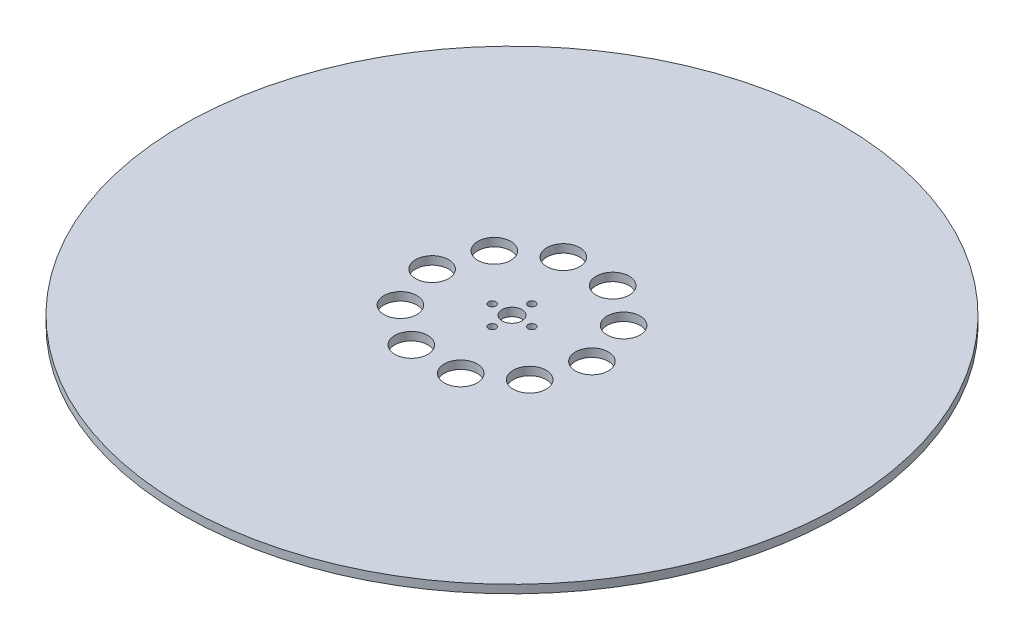
ISO-10303-21;
HEADER;
FILE_DESCRIPTION(('STEP AP214'),'2;1');
FILE_NAME('part.step','',(''),(''),'','','');
FILE_SCHEMA(('AUTOMOTIVE_DESIGN { 1 0 10303 214 1 1 1 1 }'));
ENDSEC;
DATA;
#1=APPLICATION_CONTEXT('core data for automotive mechanical design processes');
#2=APPLICATION_PROTOCOL_DEFINITION('international standard','automotive_design',2000,#1);
#3=PRODUCT_CONTEXT('',#1,'mechanical');
#4=PRODUCT('Part','Part','',(#3));
#5=PRODUCT_RELATED_PRODUCT_CATEGORY('part','',(#4));
#6=PRODUCT_DEFINITION_FORMATION('','',#4);
#7=PRODUCT_DEFINITION_CONTEXT('part definition',#1,'design');
#8=PRODUCT_DEFINITION('design','',#6,#7);
#9=PRODUCT_DEFINITION_SHAPE('','',#8);
#10=(LENGTH_UNIT() NAMED_UNIT(*) SI_UNIT(.MILLI.,.METRE.));
#11=(NAMED_UNIT(*) PLANE_ANGLE_UNIT() SI_UNIT($,.RADIAN.));
#12=(NAMED_UNIT(*) SI_UNIT($,.STERADIAN.) SOLID_ANGLE_UNIT());
#13=UNCERTAINTY_MEASURE_WITH_UNIT(LENGTH_MEASURE(1.E-05),#10,'distance_accuracy_value','');
#14=(GEOMETRIC_REPRESENTATION_CONTEXT(3) GLOBAL_UNCERTAINTY_ASSIGNED_CONTEXT((#13)) GLOBAL_UNIT_ASSIGNED_CONTEXT((#10,
#11,#12)) REPRESENTATION_CONTEXT('',''));
#15=CARTESIAN_POINT('',(0.,0.,0.));
#16=DIRECTION('',(0.,0.,1.));
#17=DIRECTION('',(1.,0.,0.));
#18=AXIS2_PLACEMENT_3D('',#15,#16,#17);
#19=CARTESIAN_POINT('',(0.,5.,0.));
#20=DIRECTION('',(0.,1.,0.));
#21=DIRECTION('',(0.,0.,1.));
#22=AXIS2_PLACEMENT_3D('',#19,#20,#21);
#23=PLANE('',#22);
#24=CARTESIAN_POINT('',(0.,5.,12.));
#25=DIRECTION('',(0.,1.,0.));
#26=DIRECTION('',(0.,0.,1.));
#27=AXIS2_PLACEMENT_3D('',#24,#25,#26);
#28=CIRCLE('',#27,2.24999999999956);
#29=CARTESIAN_POINT('',(0.,5.,14.2499999999996));
#30=VERTEX_POINT('',#29);
#31=EDGE_CURVE('E123',#30,#30,#28,.T.);
#32=ORIENTED_EDGE('',*,*,#31,.F.);
#33=EDGE_LOOP('',(#32));
#34=FACE_BOUND('',#33,.T.);
#35=CARTESIAN_POINT('',(0.,5.,0.));
#36=DIRECTION('',(0.,1.,0.));
#37=DIRECTION('',(0.,0.,1.));
#38=AXIS2_PLACEMENT_3D('',#35,#36,#37);
#39=CIRCLE('',#38,6.);
#40=CARTESIAN_POINT('',(0.,5.,6.));
#41=VERTEX_POINT('',#40);
#42=EDGE_CURVE('E111',#41,#41,#39,.T.);
#43=ORIENTED_EDGE('',*,*,#42,.F.);
#44=EDGE_LOOP('',(#43));
#45=FACE_BOUND('',#44,.T.);
#46=CARTESIAN_POINT('',(-39.2328769925078,5.,-28.504353631061));
#47=DIRECTION('',(0.,1.,0.));
#48=DIRECTION('',(0.,0.,1.));
#49=AXIS2_PLACEMENT_3D('',#46,#47,#48);
#50=CIRCLE('',#49,10.);
#51=CARTESIAN_POINT('',(-39.2328769925078,5.,-18.504353631061));
#52=VERTEX_POINT('',#51);
#53=EDGE_CURVE('E99',#52,#52,#50,.T.);
#54=ORIENTED_EDGE('',*,*,#53,.F.);
#55=EDGE_LOOP('',(#54));
#56=FACE_BOUND('',#55,.T.);
#57=CARTESIAN_POINT('',(-39.2328769925087,5.,28.5043536310598));
#58=DIRECTION('',(0.,1.,0.));
#59=DIRECTION('',(0.,0.,1.));
#60=AXIS2_PLACEMENT_3D('',#57,#58,#59);
#61=CIRCLE('',#60,10.);
#62=CARTESIAN_POINT('',(-39.2328769925087,5.,38.5043536310598));
#63=VERTEX_POINT('',#62);
#64=EDGE_CURVE('E87',#63,#63,#61,.T.);
#65=ORIENTED_EDGE('',*,*,#64,.F.);
#66=EDGE_LOOP('',(#65));
#67=FACE_BOUND('',#66,.T.);
#68=CARTESIAN_POINT('',(14.9856255346939,5.,46.1210130024023));
#69=DIRECTION('',(0.,1.,0.));
#70=DIRECTION('',(0.,0.,1.));
#71=AXIS2_PLACEMENT_3D('',#68,#69,#70);
#72=CIRCLE('',#71,10.);
#73=CARTESIAN_POINT('',(14.9856255346939,5.,56.1210130024023));
#74=VERTEX_POINT('',#73);
#75=EDGE_CURVE('E75',#74,#74,#72,.T.);
#76=ORIENTED_EDGE('',*,*,#75,.F.);
#77=EDGE_LOOP('',(#76));
#78=FACE_BOUND('',#77,.T.);
#79=CARTESIAN_POINT('',(48.4945029156278,5.,4.45823933326039E-13));
#80=DIRECTION('',(0.,1.,0.));
#81=DIRECTION('',(0.,0.,1.));
#82=AXIS2_PLACEMENT_3D('',#79,#80,#81);
#83=CIRCLE('',#82,10.);
#84=CARTESIAN_POINT('',(48.4945029156278,5.,10.0000000000005));
#85=VERTEX_POINT('',#84);
#86=EDGE_CURVE('E63',#85,#85,#83,.T.);
#87=ORIENTED_EDGE('',*,*,#86,.F.);
#88=EDGE_LOOP('',(#87));
#89=FACE_BOUND('',#88,.T.);
#90=CARTESIAN_POINT('',(14.9856255346947,5.,-46.121013002402));
#91=DIRECTION('',(0.,1.,0.));
#92=DIRECTION('',(0.,0.,1.));
#93=AXIS2_PLACEMENT_3D('',#90,#91,#92);
#94=CIRCLE('',#93,10.);
#95=CARTESIAN_POINT('',(14.9856255346947,5.,-36.121013002402));
#96=VERTEX_POINT('',#95);
#97=EDGE_CURVE('E51',#96,#96,#94,.T.);
#98=ORIENTED_EDGE('',*,*,#97,.F.);
#99=EDGE_LOOP('',(#98));
#100=FACE_BOUND('',#99,.T.);
#101=CARTESIAN_POINT('',(0.,5.,0.));
#102=DIRECTION('',(0.,1.,0.));
#103=DIRECTION('',(0.,0.,1.));
#104=AXIS2_PLACEMENT_3D('',#101,#102,#103);
#105=CIRCLE('',#104,200.);
#106=CARTESIAN_POINT('',(0.,5.,200.));
#107=VERTEX_POINT('',#106);
#108=EDGE_CURVE('E10',#107,#107,#105,.T.);
#109=ORIENTED_EDGE('',*,*,#108,.T.);
#110=EDGE_LOOP('',(#109));
#111=FACE_BOUND('',#110,.T.);
#112=CARTESIAN_POINT('',(-14.9856255346942,5.,-46.1210130024022));
#113=DIRECTION('',(0.,1.,0.));
#114=DIRECTION('',(0.,0.,1.));
#115=AXIS2_PLACEMENT_3D('',#112,#113,#114);
#116=CIRCLE('',#115,10.);
#117=CARTESIAN_POINT('',(-14.9856255346942,5.,-36.1210130024022));
#118=VERTEX_POINT('',#117);
#119=EDGE_CURVE('E46',#118,#118,#116,.T.);
#120=ORIENTED_EDGE('',*,*,#119,.F.);
#121=EDGE_LOOP('',(#120));
#122=FACE_BOUND('',#121,.T.);
#123=CARTESIAN_POINT('',(39.2328769925085,5.,-28.50435363106));
#124=DIRECTION('',(0.,1.,0.));
#125=DIRECTION('',(0.,0.,1.));
#126=AXIS2_PLACEMENT_3D('',#123,#124,#125);
#127=CIRCLE('',#126,10.);
#128=CARTESIAN_POINT('',(39.2328769925085,5.,-18.50435363106));
#129=VERTEX_POINT('',#128);
#130=EDGE_CURVE('E57',#129,#129,#127,.T.);
#131=ORIENTED_EDGE('',*,*,#130,.F.);
#132=EDGE_LOOP('',(#131));
#133=FACE_BOUND('',#132,.T.);
#134=CARTESIAN_POINT('',(39.232876992508,5.,28.5043536310608));
#135=DIRECTION('',(0.,1.,0.));
#136=DIRECTION('',(0.,0.,1.));
#137=AXIS2_PLACEMENT_3D('',#134,#135,#136);
#138=CIRCLE('',#137,10.);
#139=CARTESIAN_POINT('',(39.232876992508,5.,38.5043536310608));
#140=VERTEX_POINT('',#139);
#141=EDGE_CURVE('E69',#140,#140,#138,.T.);
#142=ORIENTED_EDGE('',*,*,#141,.F.);
#143=EDGE_LOOP('',(#142));
#144=FACE_BOUND('',#143,.T.);
#145=CARTESIAN_POINT('',(-14.9856255346951,5.,46.1210130024019));
#146=DIRECTION('',(0.,1.,0.));
#147=DIRECTION('',(0.,0.,1.));
#148=AXIS2_PLACEMENT_3D('',#145,#146,#147);
#149=CIRCLE('',#148,10.);
#150=CARTESIAN_POINT('',(-14.9856255346951,5.,56.1210130024019));
#151=VERTEX_POINT('',#150);
#152=EDGE_CURVE('E81',#151,#151,#149,.T.);
#153=ORIENTED_EDGE('',*,*,#152,.F.);
#154=EDGE_LOOP('',(#153));
#155=FACE_BOUND('',#154,.T.);
#156=CARTESIAN_POINT('',(-48.4945029156277,5.,-7.92768628521401E-13));
#157=DIRECTION('',(0.,1.,0.));
#158=DIRECTION('',(0.,0.,1.));
#159=AXIS2_PLACEMENT_3D('',#156,#157,#158);
#160=CIRCLE('',#159,10.);
#161=CARTESIAN_POINT('',(-48.4945029156277,5.,9.99999999999921));
#162=VERTEX_POINT('',#161);
#163=EDGE_CURVE('E93',#162,#162,#160,.T.);
#164=ORIENTED_EDGE('',*,*,#163,.F.);
#165=EDGE_LOOP('',(#164));
#166=FACE_BOUND('',#165,.T.);
#167=CARTESIAN_POINT('',(0.,5.,-12.));
#168=DIRECTION('',(0.,1.,0.));
#169=DIRECTION('',(0.,0.,1.));
#170=AXIS2_PLACEMENT_3D('',#167,#168,#169);
#171=CIRCLE('',#170,2.24999999999956);
#172=CARTESIAN_POINT('',(0.,5.,-9.75000000000044));
#173=VERTEX_POINT('',#172);
#174=EDGE_CURVE('E105',#173,#173,#171,.T.);
#175=ORIENTED_EDGE('',*,*,#174,.F.);
#176=EDGE_LOOP('',(#175));
#177=FACE_BOUND('',#176,.T.);
#178=CARTESIAN_POINT('',(12.,5.,0.));
#179=DIRECTION('',(0.,1.,0.));
#180=DIRECTION('',(0.,0.,1.));
#181=AXIS2_PLACEMENT_3D('',#178,#179,#180);
#182=CIRCLE('',#181,2.24999999999956);
#183=CARTESIAN_POINT('',(12.,5.,2.2499999999996));
#184=VERTEX_POINT('',#183);
#185=EDGE_CURVE('E117',#184,#184,#182,.T.);
#186=ORIENTED_EDGE('',*,*,#185,.F.);
#187=EDGE_LOOP('',(#186));
#188=FACE_BOUND('',#187,.T.);
#189=CARTESIAN_POINT('',(-12.,5.,-1.25693328198353E-13));
#190=DIRECTION('',(0.,1.,0.));
#191=DIRECTION('',(0.,0.,1.));
#192=AXIS2_PLACEMENT_3D('',#189,#190,#191);
#193=CIRCLE('',#192,2.24999999999956);
#194=CARTESIAN_POINT('',(-12.,5.,2.24999999999944));
#195=VERTEX_POINT('',#194);
#196=EDGE_CURVE('E129',#195,#195,#193,.T.);
#197=ORIENTED_EDGE('',*,*,#196,.F.);
#198=EDGE_LOOP('',(#197));
#199=FACE_BOUND('',#198,.T.);
#200=ADVANCED_FACE('F35',(#34,#45,#56,#67,#78,#89,#100,#111,#122,#133,#144,#155,#166,#177,#188,
#199),#23,.T.);
#201=CARTESIAN_POINT('',(0.,0.,0.));
#202=DIRECTION('',(0.,1.,0.));
#203=DIRECTION('',(0.,0.,1.));
#204=AXIS2_PLACEMENT_3D('',#201,#202,#203);
#205=PLANE('',#204);
#206=CARTESIAN_POINT('',(0.,0.,0.));
#207=DIRECTION('',(0.,1.,0.));
#208=DIRECTION('',(0.,0.,1.));
#209=AXIS2_PLACEMENT_3D('',#206,#207,#208);
#210=CIRCLE('',#209,200.);
#211=CARTESIAN_POINT('',(0.,0.,200.));
#212=VERTEX_POINT('',#211);
#213=EDGE_CURVE('E39',#212,#212,#210,.T.);
#214=ORIENTED_EDGE('',*,*,#213,.F.);
#215=EDGE_LOOP('',(#214));
#216=FACE_BOUND('',#215,.T.);
#217=CARTESIAN_POINT('',(-14.9856255346942,0.,-46.1210130024022));
#218=DIRECTION('',(0.,1.,0.));
#219=DIRECTION('',(0.,0.,1.));
#220=AXIS2_PLACEMENT_3D('',#217,#218,#219);
#221=CIRCLE('',#220,10.);
#222=CARTESIAN_POINT('',(-14.9856255346942,0.,-36.1210130024022));
#223=VERTEX_POINT('',#222);
#224=EDGE_CURVE('E48',#223,#223,#221,.T.);
#225=ORIENTED_EDGE('',*,*,#224,.T.);
#226=EDGE_LOOP('',(#225));
#227=FACE_BOUND('',#226,.T.);
#228=CARTESIAN_POINT('',(14.9856255346947,0.,-46.121013002402));
#229=DIRECTION('',(0.,1.,0.));
#230=DIRECTION('',(0.,0.,1.));
#231=AXIS2_PLACEMENT_3D('',#228,#229,#230);
#232=CIRCLE('',#231,10.);
#233=CARTESIAN_POINT('',(14.9856255346947,0.,-36.121013002402));
#234=VERTEX_POINT('',#233);
#235=EDGE_CURVE('E54',#234,#234,#232,.T.);
#236=ORIENTED_EDGE('',*,*,#235,.T.);
#237=EDGE_LOOP('',(#236));
#238=FACE_BOUND('',#237,.T.);
#239=CARTESIAN_POINT('',(39.2328769925085,0.,-28.50435363106));
#240=DIRECTION('',(0.,1.,0.));
#241=DIRECTION('',(0.,0.,1.));
#242=AXIS2_PLACEMENT_3D('',#239,#240,#241);
#243=CIRCLE('',#242,10.);
#244=CARTESIAN_POINT('',(39.2328769925085,0.,-18.50435363106));
#245=VERTEX_POINT('',#244);
#246=EDGE_CURVE('E60',#245,#245,#243,.T.);
#247=ORIENTED_EDGE('',*,*,#246,.T.);
#248=EDGE_LOOP('',(#247));
#249=FACE_BOUND('',#248,.T.);
#250=CARTESIAN_POINT('',(48.4945029156278,0.,4.45823933326039E-13));
#251=DIRECTION('',(0.,1.,0.));
#252=DIRECTION('',(0.,0.,1.));
#253=AXIS2_PLACEMENT_3D('',#250,#251,#252);
#254=CIRCLE('',#253,10.);
#255=CARTESIAN_POINT('',(48.4945029156278,0.,10.0000000000005));
#256=VERTEX_POINT('',#255);
#257=EDGE_CURVE('E66',#256,#256,#254,.T.);
#258=ORIENTED_EDGE('',*,*,#257,.T.);
#259=EDGE_LOOP('',(#258));
#260=FACE_BOUND('',#259,.T.);
#261=CARTESIAN_POINT('',(39.232876992508,0.,28.5043536310608));
#262=DIRECTION('',(0.,1.,0.));
#263=DIRECTION('',(0.,0.,1.));
#264=AXIS2_PLACEMENT_3D('',#261,#262,#263);
#265=CIRCLE('',#264,10.);
#266=CARTESIAN_POINT('',(39.232876992508,0.,38.5043536310608));
#267=VERTEX_POINT('',#266);
#268=EDGE_CURVE('E72',#267,#267,#265,.T.);
#269=ORIENTED_EDGE('',*,*,#268,.T.);
#270=EDGE_LOOP('',(#269));
#271=FACE_BOUND('',#270,.T.);
#272=CARTESIAN_POINT('',(14.9856255346939,0.,46.1210130024023));
#273=DIRECTION('',(0.,1.,0.));
#274=DIRECTION('',(0.,0.,1.));
#275=AXIS2_PLACEMENT_3D('',#272,#273,#274);
#276=CIRCLE('',#275,10.);
#277=CARTESIAN_POINT('',(14.9856255346939,0.,56.1210130024023));
#278=VERTEX_POINT('',#277);
#279=EDGE_CURVE('E78',#278,#278,#276,.T.);
#280=ORIENTED_EDGE('',*,*,#279,.T.);
#281=EDGE_LOOP('',(#280));
#282=FACE_BOUND('',#281,.T.);
#283=CARTESIAN_POINT('',(-14.9856255346951,0.,46.1210130024019));
#284=DIRECTION('',(0.,1.,0.));
#285=DIRECTION('',(0.,0.,1.));
#286=AXIS2_PLACEMENT_3D('',#283,#284,#285);
#287=CIRCLE('',#286,10.);
#288=CARTESIAN_POINT('',(-14.9856255346951,0.,56.1210130024019));
#289=VERTEX_POINT('',#288);
#290=EDGE_CURVE('E84',#289,#289,#287,.T.);
#291=ORIENTED_EDGE('',*,*,#290,.T.);
#292=EDGE_LOOP('',(#291));
#293=FACE_BOUND('',#292,.T.);
#294=CARTESIAN_POINT('',(-39.2328769925087,0.,28.5043536310598));
#295=DIRECTION('',(0.,1.,0.));
#296=DIRECTION('',(0.,0.,1.));
#297=AXIS2_PLACEMENT_3D('',#294,#295,#296);
#298=CIRCLE('',#297,10.);
#299=CARTESIAN_POINT('',(-39.2328769925087,0.,38.5043536310598));
#300=VERTEX_POINT('',#299);
#301=EDGE_CURVE('E90',#300,#300,#298,.T.);
#302=ORIENTED_EDGE('',*,*,#301,.T.);
#303=EDGE_LOOP('',(#302));
#304=FACE_BOUND('',#303,.T.);
#305=CARTESIAN_POINT('',(-48.4945029156277,0.,-7.92768628521401E-13));
#306=DIRECTION('',(0.,1.,0.));
#307=DIRECTION('',(0.,0.,1.));
#308=AXIS2_PLACEMENT_3D('',#305,#306,#307);
#309=CIRCLE('',#308,10.);
#310=CARTESIAN_POINT('',(-48.4945029156277,0.,9.99999999999921));
#311=VERTEX_POINT('',#310);
#312=EDGE_CURVE('E96',#311,#311,#309,.T.);
#313=ORIENTED_EDGE('',*,*,#312,.T.);
#314=EDGE_LOOP('',(#313));
#315=FACE_BOUND('',#314,.T.);
#316=CARTESIAN_POINT('',(-39.2328769925078,0.,-28.504353631061));
#317=DIRECTION('',(0.,1.,0.));
#318=DIRECTION('',(0.,0.,1.));
#319=AXIS2_PLACEMENT_3D('',#316,#317,#318);
#320=CIRCLE('',#319,10.);
#321=CARTESIAN_POINT('',(-39.2328769925078,0.,-18.504353631061));
#322=VERTEX_POINT('',#321);
#323=EDGE_CURVE('E102',#322,#322,#320,.T.);
#324=ORIENTED_EDGE('',*,*,#323,.T.);
#325=EDGE_LOOP('',(#324));
#326=FACE_BOUND('',#325,.T.);
#327=CARTESIAN_POINT('',(0.,0.,-12.));
#328=DIRECTION('',(0.,1.,0.));
#329=DIRECTION('',(0.,0.,1.));
#330=AXIS2_PLACEMENT_3D('',#327,#328,#329);
#331=CIRCLE('',#330,2.24999999999956);
#332=CARTESIAN_POINT('',(0.,0.,-9.75000000000044));
#333=VERTEX_POINT('',#332);
#334=EDGE_CURVE('E108',#333,#333,#331,.T.);
#335=ORIENTED_EDGE('',*,*,#334,.T.);
#336=EDGE_LOOP('',(#335));
#337=FACE_BOUND('',#336,.T.);
#338=CARTESIAN_POINT('',(0.,0.,0.));
#339=DIRECTION('',(0.,1.,0.));
#340=DIRECTION('',(0.,0.,1.));
#341=AXIS2_PLACEMENT_3D('',#338,#339,#340);
#342=CIRCLE('',#341,6.);
#343=CARTESIAN_POINT('',(0.,0.,6.));
#344=VERTEX_POINT('',#343);
#345=EDGE_CURVE('E114',#344,#344,#342,.T.);
#346=ORIENTED_EDGE('',*,*,#345,.T.);
#347=EDGE_LOOP('',(#346));
#348=FACE_BOUND('',#347,.T.);
#349=CARTESIAN_POINT('',(12.,0.,0.));
#350=DIRECTION('',(0.,1.,0.));
#351=DIRECTION('',(0.,0.,1.));
#352=AXIS2_PLACEMENT_3D('',#349,#350,#351);
#353=CIRCLE('',#352,2.24999999999956);
#354=CARTESIAN_POINT('',(12.,0.,2.2499999999996));
#355=VERTEX_POINT('',#354);
#356=EDGE_CURVE('E120',#355,#355,#353,.T.);
#357=ORIENTED_EDGE('',*,*,#356,.T.);
#358=EDGE_LOOP('',(#357));
#359=FACE_BOUND('',#358,.T.);
#360=CARTESIAN_POINT('',(0.,0.,12.));
#361=DIRECTION('',(0.,1.,0.));
#362=DIRECTION('',(0.,0.,1.));
#363=AXIS2_PLACEMENT_3D('',#360,#361,#362);
#364=CIRCLE('',#363,2.24999999999956);
#365=CARTESIAN_POINT('',(0.,0.,14.2499999999996));
#366=VERTEX_POINT('',#365);
#367=EDGE_CURVE('E126',#366,#366,#364,.T.);
#368=ORIENTED_EDGE('',*,*,#367,.T.);
#369=EDGE_LOOP('',(#368));
#370=FACE_BOUND('',#369,.T.);
#371=CARTESIAN_POINT('',(-12.,0.,-1.25693328198353E-13));
#372=DIRECTION('',(0.,1.,0.));
#373=DIRECTION('',(0.,0.,1.));
#374=AXIS2_PLACEMENT_3D('',#371,#372,#373);
#375=CIRCLE('',#374,2.24999999999956);
#376=CARTESIAN_POINT('',(-12.,0.,2.24999999999944));
#377=VERTEX_POINT('',#376);
#378=EDGE_CURVE('E132',#377,#377,#375,.T.);
#379=ORIENTED_EDGE('',*,*,#378,.T.);
#380=EDGE_LOOP('',(#379));
#381=FACE_BOUND('',#380,.T.);
#382=ADVANCED_FACE('F142',(#216,#227,#238,#249,#260,#271,#282,#293,#304,#315,#326,#337,#348,
#359,#370,#381),#205,.F.);
#383=CARTESIAN_POINT('',(0.,5.,0.));
#384=DIRECTION('',(0.,-1.,0.));
#385=DIRECTION('',(0.,0.,-1.));
#386=AXIS2_PLACEMENT_3D('',#383,#384,#385);
#387=CYLINDRICAL_SURFACE('',#386,200.);
#388=ORIENTED_EDGE('',*,*,#108,.F.);
#389=EDGE_LOOP('',(#388));
#390=FACE_BOUND('',#389,.T.);
#391=ORIENTED_EDGE('',*,*,#213,.T.);
#392=EDGE_LOOP('',(#391));
#393=FACE_BOUND('',#392,.T.);
#394=ADVANCED_FACE('F37',(#390,#393),#387,.T.);
#395=CARTESIAN_POINT('',(-14.9856255346942,5.,-46.1210130024022));
#396=DIRECTION('',(0.,-1.,0.));
#397=DIRECTION('',(0.,0.,-1.));
#398=AXIS2_PLACEMENT_3D('',#395,#396,#397);
#399=CYLINDRICAL_SURFACE('',#398,10.);
#400=ORIENTED_EDGE('',*,*,#119,.T.);
#401=EDGE_LOOP('',(#400));
#402=FACE_BOUND('',#401,.T.);
#403=ORIENTED_EDGE('',*,*,#224,.F.);
#404=EDGE_LOOP('',(#403));
#405=FACE_BOUND('',#404,.T.);
#406=ADVANCED_FACE('F152',(#402,#405),#399,.F.);
#407=CARTESIAN_POINT('',(14.9856255346947,5.,-46.121013002402));
#408=DIRECTION('',(0.,-1.,0.));
#409=DIRECTION('',(0.,0.,-1.));
#410=AXIS2_PLACEMENT_3D('',#407,#408,#409);
#411=CYLINDRICAL_SURFACE('',#410,10.);
#412=ORIENTED_EDGE('',*,*,#97,.T.);
#413=EDGE_LOOP('',(#412));
#414=FACE_BOUND('',#413,.T.);
#415=ORIENTED_EDGE('',*,*,#235,.F.);
#416=EDGE_LOOP('',(#415));
#417=FACE_BOUND('',#416,.T.);
#418=ADVANCED_FACE('F155',(#414,#417),#411,.F.);
#419=CARTESIAN_POINT('',(39.2328769925085,5.,-28.50435363106));
#420=DIRECTION('',(0.,-1.,0.));
#421=DIRECTION('',(0.,0.,-1.));
#422=AXIS2_PLACEMENT_3D('',#419,#420,#421);
#423=CYLINDRICAL_SURFACE('',#422,10.);
#424=ORIENTED_EDGE('',*,*,#130,.T.);
#425=EDGE_LOOP('',(#424));
#426=FACE_BOUND('',#425,.T.);
#427=ORIENTED_EDGE('',*,*,#246,.F.);
#428=EDGE_LOOP('',(#427));
#429=FACE_BOUND('',#428,.T.);
#430=ADVANCED_FACE('F159',(#426,#429),#423,.F.);
#431=CARTESIAN_POINT('',(48.4945029156278,5.,4.45823933326039E-13));
#432=DIRECTION('',(0.,-1.,0.));
#433=DIRECTION('',(0.,0.,-1.));
#434=AXIS2_PLACEMENT_3D('',#431,#432,#433);
#435=CYLINDRICAL_SURFACE('',#434,10.);
#436=ORIENTED_EDGE('',*,*,#86,.T.);
#437=EDGE_LOOP('',(#436));
#438=FACE_BOUND('',#437,.T.);
#439=ORIENTED_EDGE('',*,*,#257,.F.);
#440=EDGE_LOOP('',(#439));
#441=FACE_BOUND('',#440,.T.);
#442=ADVANCED_FACE('F163',(#438,#441),#435,.F.);
#443=CARTESIAN_POINT('',(39.232876992508,5.,28.5043536310608));
#444=DIRECTION('',(0.,-1.,0.));
#445=DIRECTION('',(0.,0.,-1.));
#446=AXIS2_PLACEMENT_3D('',#443,#444,#445);
#447=CYLINDRICAL_SURFACE('',#446,10.);
#448=ORIENTED_EDGE('',*,*,#141,.T.);
#449=EDGE_LOOP('',(#448));
#450=FACE_BOUND('',#449,.T.);
#451=ORIENTED_EDGE('',*,*,#268,.F.);
#452=EDGE_LOOP('',(#451));
#453=FACE_BOUND('',#452,.T.);
#454=ADVANCED_FACE('F167',(#450,#453),#447,.F.);
#455=CARTESIAN_POINT('',(14.9856255346939,5.,46.1210130024023));
#456=DIRECTION('',(0.,-1.,0.));
#457=DIRECTION('',(0.,0.,-1.));
#458=AXIS2_PLACEMENT_3D('',#455,#456,#457);
#459=CYLINDRICAL_SURFACE('',#458,10.);
#460=ORIENTED_EDGE('',*,*,#75,.T.);
#461=EDGE_LOOP('',(#460));
#462=FACE_BOUND('',#461,.T.);
#463=ORIENTED_EDGE('',*,*,#279,.F.);
#464=EDGE_LOOP('',(#463));
#465=FACE_BOUND('',#464,.T.);
#466=ADVANCED_FACE('F171',(#462,#465),#459,.F.);
#467=CARTESIAN_POINT('',(-14.9856255346951,5.,46.1210130024019));
#468=DIRECTION('',(0.,-1.,0.));
#469=DIRECTION('',(0.,0.,-1.));
#470=AXIS2_PLACEMENT_3D('',#467,#468,#469);
#471=CYLINDRICAL_SURFACE('',#470,10.);
#472=ORIENTED_EDGE('',*,*,#152,.T.);
#473=EDGE_LOOP('',(#472));
#474=FACE_BOUND('',#473,.T.);
#475=ORIENTED_EDGE('',*,*,#290,.F.);
#476=EDGE_LOOP('',(#475));
#477=FACE_BOUND('',#476,.T.);
#478=ADVANCED_FACE('F175',(#474,#477),#471,.F.);
#479=CARTESIAN_POINT('',(-39.2328769925087,5.,28.5043536310598));
#480=DIRECTION('',(0.,-1.,0.));
#481=DIRECTION('',(0.,0.,-1.));
#482=AXIS2_PLACEMENT_3D('',#479,#480,#481);
#483=CYLINDRICAL_SURFACE('',#482,10.);
#484=ORIENTED_EDGE('',*,*,#64,.T.);
#485=EDGE_LOOP('',(#484));
#486=FACE_BOUND('',#485,.T.);
#487=ORIENTED_EDGE('',*,*,#301,.F.);
#488=EDGE_LOOP('',(#487));
#489=FACE_BOUND('',#488,.T.);
#490=ADVANCED_FACE('F179',(#486,#489),#483,.F.);
#491=CARTESIAN_POINT('',(-48.4945029156277,5.,-7.92768628521401E-13));
#492=DIRECTION('',(0.,-1.,0.));
#493=DIRECTION('',(0.,0.,-1.));
#494=AXIS2_PLACEMENT_3D('',#491,#492,#493);
#495=CYLINDRICAL_SURFACE('',#494,10.);
#496=ORIENTED_EDGE('',*,*,#163,.T.);
#497=EDGE_LOOP('',(#496));
#498=FACE_BOUND('',#497,.T.);
#499=ORIENTED_EDGE('',*,*,#312,.F.);
#500=EDGE_LOOP('',(#499));
#501=FACE_BOUND('',#500,.T.);
#502=ADVANCED_FACE('F183',(#498,#501),#495,.F.);
#503=CARTESIAN_POINT('',(-39.2328769925078,5.,-28.504353631061));
#504=DIRECTION('',(0.,-1.,0.));
#505=DIRECTION('',(0.,0.,-1.));
#506=AXIS2_PLACEMENT_3D('',#503,#504,#505);
#507=CYLINDRICAL_SURFACE('',#506,10.);
#508=ORIENTED_EDGE('',*,*,#53,.T.);
#509=EDGE_LOOP('',(#508));
#510=FACE_BOUND('',#509,.T.);
#511=ORIENTED_EDGE('',*,*,#323,.F.);
#512=EDGE_LOOP('',(#511));
#513=FACE_BOUND('',#512,.T.);
#514=ADVANCED_FACE('F187',(#510,#513),#507,.F.);
#515=CARTESIAN_POINT('',(0.,5.,-12.));
#516=DIRECTION('',(0.,-1.,0.));
#517=DIRECTION('',(0.,0.,-1.));
#518=AXIS2_PLACEMENT_3D('',#515,#516,#517);
#519=CYLINDRICAL_SURFACE('',#518,2.24999999999956);
#520=ORIENTED_EDGE('',*,*,#174,.T.);
#521=EDGE_LOOP('',(#520));
#522=FACE_BOUND('',#521,.T.);
#523=ORIENTED_EDGE('',*,*,#334,.F.);
#524=EDGE_LOOP('',(#523));
#525=FACE_BOUND('',#524,.T.);
#526=ADVANCED_FACE('F191',(#522,#525),#519,.F.);
#527=CARTESIAN_POINT('',(0.,5.,0.));
#528=DIRECTION('',(0.,-1.,0.));
#529=DIRECTION('',(0.,0.,-1.));
#530=AXIS2_PLACEMENT_3D('',#527,#528,#529);
#531=CYLINDRICAL_SURFACE('',#530,6.);
#532=ORIENTED_EDGE('',*,*,#42,.T.);
#533=EDGE_LOOP('',(#532));
#534=FACE_BOUND('',#533,.T.);
#535=ORIENTED_EDGE('',*,*,#345,.F.);
#536=EDGE_LOOP('',(#535));
#537=FACE_BOUND('',#536,.T.);
#538=ADVANCED_FACE('F195',(#534,#537),#531,.F.);
#539=CARTESIAN_POINT('',(12.,5.,0.));
#540=DIRECTION('',(0.,-1.,0.));
#541=DIRECTION('',(0.,0.,-1.));
#542=AXIS2_PLACEMENT_3D('',#539,#540,#541);
#543=CYLINDRICAL_SURFACE('',#542,2.24999999999956);
#544=ORIENTED_EDGE('',*,*,#185,.T.);
#545=EDGE_LOOP('',(#544));
#546=FACE_BOUND('',#545,.T.);
#547=ORIENTED_EDGE('',*,*,#356,.F.);
#548=EDGE_LOOP('',(#547));
#549=FACE_BOUND('',#548,.T.);
#550=ADVANCED_FACE('F199',(#546,#549),#543,.F.);
#551=CARTESIAN_POINT('',(0.,5.,12.));
#552=DIRECTION('',(0.,-1.,0.));
#553=DIRECTION('',(0.,0.,-1.));
#554=AXIS2_PLACEMENT_3D('',#551,#552,#553);
#555=CYLINDRICAL_SURFACE('',#554,2.24999999999956);
#556=ORIENTED_EDGE('',*,*,#31,.T.);
#557=EDGE_LOOP('',(#556));
#558=FACE_BOUND('',#557,.T.);
#559=ORIENTED_EDGE('',*,*,#367,.F.);
#560=EDGE_LOOP('',(#559));
#561=FACE_BOUND('',#560,.T.);
#562=ADVANCED_FACE('F203',(#558,#561),#555,.F.);
#563=CARTESIAN_POINT('',(-12.,5.,-1.25693328198353E-13));
#564=DIRECTION('',(0.,-1.,0.));
#565=DIRECTION('',(0.,0.,-1.));
#566=AXIS2_PLACEMENT_3D('',#563,#564,#565);
#567=CYLINDRICAL_SURFACE('',#566,2.24999999999956);
#568=ORIENTED_EDGE('',*,*,#196,.T.);
#569=EDGE_LOOP('',(#568));
#570=FACE_BOUND('',#569,.T.);
#571=ORIENTED_EDGE('',*,*,#378,.F.);
#572=EDGE_LOOP('',(#571));
#573=FACE_BOUND('',#572,.T.);
#574=ADVANCED_FACE('F138',(#570,#573),#567,.F.);
#575=CLOSED_SHELL('',(#200,#382,#394,#406,#418,#430,#442,#454,#466,#478,#490,#502,#514,#526,
#538,#550,#562,#574));
#576=MANIFOLD_SOLID_BREP('B2',#575);
#577=ADVANCED_BREP_SHAPE_REPRESENTATION('',(#18,#576),#14);
#578=SHAPE_DEFINITION_REPRESENTATION(#9,#577);
ENDSEC;
END-ISO-10303-21;
